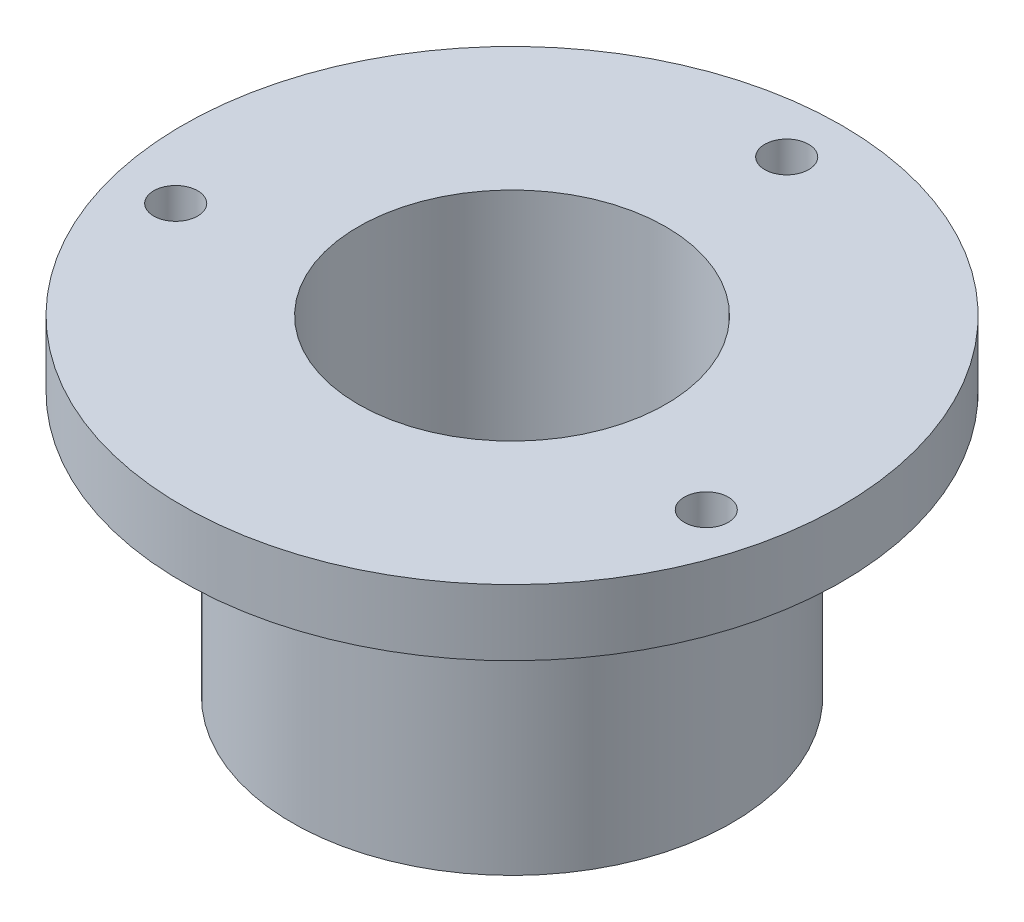
ISO-10303-21;
HEADER;
FILE_DESCRIPTION(('STEP AP214'),'2;1');
FILE_NAME('part.step','',(''),(''),'','','');
FILE_SCHEMA(('AUTOMOTIVE_DESIGN { 1 0 10303 214 1 1 1 1 }'));
ENDSEC;
DATA;
#1=APPLICATION_CONTEXT('core data for automotive mechanical design processes');
#2=APPLICATION_PROTOCOL_DEFINITION('international standard','automotive_design',2000,#1);
#3=PRODUCT_CONTEXT('',#1,'mechanical');
#4=PRODUCT('Part','Part','',(#3));
#5=PRODUCT_RELATED_PRODUCT_CATEGORY('part','',(#4));
#6=PRODUCT_DEFINITION_FORMATION('','',#4);
#7=PRODUCT_DEFINITION_CONTEXT('part definition',#1,'design');
#8=PRODUCT_DEFINITION('design','',#6,#7);
#9=PRODUCT_DEFINITION_SHAPE('','',#8);
#10=(LENGTH_UNIT() NAMED_UNIT(*) SI_UNIT(.MILLI.,.METRE.));
#11=(NAMED_UNIT(*) PLANE_ANGLE_UNIT() SI_UNIT($,.RADIAN.));
#12=(NAMED_UNIT(*) SI_UNIT($,.STERADIAN.) SOLID_ANGLE_UNIT());
#13=UNCERTAINTY_MEASURE_WITH_UNIT(LENGTH_MEASURE(1.E-05),#10,'distance_accuracy_value','');
#14=(GEOMETRIC_REPRESENTATION_CONTEXT(3) GLOBAL_UNCERTAINTY_ASSIGNED_CONTEXT((#13)) GLOBAL_UNIT_ASSIGNED_CONTEXT((#10,
#11,#12)) REPRESENTATION_CONTEXT('',''));
#15=CARTESIAN_POINT('',(0.,0.,0.));
#16=DIRECTION('',(0.,0.,1.));
#17=DIRECTION('',(1.,0.,0.));
#18=AXIS2_PLACEMENT_3D('',#15,#16,#17);
#19=CARTESIAN_POINT('',(7.,0.,0.));
#20=DIRECTION('',(0.,-1.,0.));
#21=DIRECTION('',(0.,0.,-1.));
#22=AXIS2_PLACEMENT_3D('',#19,#20,#21);
#23=PLANE('',#22);
#24=CARTESIAN_POINT('',(0.,0.,8.5));
#25=DIRECTION('',(0.,-1.,0.));
#26=DIRECTION('',(0.,0.,-1.));
#27=AXIS2_PLACEMENT_3D('',#24,#25,#26);
#28=CIRCLE('',#27,0.8);
#29=CARTESIAN_POINT('',(0.,0.,7.7));
#30=VERTEX_POINT('',#29);
#31=EDGE_CURVE('E87',#30,#30,#28,.T.);
#32=ORIENTED_EDGE('',*,*,#31,.F.);
#33=EDGE_LOOP('',(#32));
#34=FACE_BOUND('',#33,.T.);
#35=CARTESIAN_POINT('',(7.36121593216771,0.,-4.25000000000003));
#36=DIRECTION('',(0.,-1.,0.));
#37=DIRECTION('',(0.,0.,-1.));
#38=AXIS2_PLACEMENT_3D('',#35,#36,#37);
#39=CIRCLE('',#38,0.8);
#40=CARTESIAN_POINT('',(7.36121593216771,0.,-5.05000000000004));
#41=VERTEX_POINT('',#40);
#42=EDGE_CURVE('E81',#41,#41,#39,.T.);
#43=ORIENTED_EDGE('',*,*,#42,.F.);
#44=EDGE_LOOP('',(#43));
#45=FACE_BOUND('',#44,.T.);
#46=CARTESIAN_POINT('',(-7.36121593216777,0.,-4.24999999999993));
#47=DIRECTION('',(0.,-1.,0.));
#48=DIRECTION('',(0.,0.,-1.));
#49=AXIS2_PLACEMENT_3D('',#46,#47,#48);
#50=CIRCLE('',#49,0.8);
#51=CARTESIAN_POINT('',(-7.36121593216777,0.,-5.04999999999993));
#52=VERTEX_POINT('',#51);
#53=EDGE_CURVE('E75',#52,#52,#50,.T.);
#54=ORIENTED_EDGE('',*,*,#53,.F.);
#55=EDGE_LOOP('',(#54));
#56=FACE_BOUND('',#55,.T.);
#57=CARTESIAN_POINT('',(0.,0.,0.));
#58=DIRECTION('',(0.,-1.,0.));
#59=DIRECTION('',(0.,0.,-1.));
#60=AXIS2_PLACEMENT_3D('',#57,#58,#59);
#61=CIRCLE('',#60,10.);
#62=CARTESIAN_POINT('',(0.,0.,-10.));
#63=VERTEX_POINT('',#62);
#64=EDGE_CURVE('E10',#63,#63,#61,.T.);
#65=ORIENTED_EDGE('',*,*,#64,.T.);
#66=EDGE_LOOP('',(#65));
#67=FACE_BOUND('',#66,.T.);
#68=CARTESIAN_POINT('',(0.,0.,0.));
#69=DIRECTION('',(0.,-1.,0.));
#70=DIRECTION('',(0.,0.,-1.));
#71=AXIS2_PLACEMENT_3D('',#68,#69,#70);
#72=CIRCLE('',#71,7.);
#73=CARTESIAN_POINT('',(0.,0.,-7.));
#74=VERTEX_POINT('',#73);
#75=EDGE_CURVE('E53',#74,#74,#72,.T.);
#76=ORIENTED_EDGE('',*,*,#75,.F.);
#77=EDGE_LOOP('',(#76));
#78=FACE_BOUND('',#77,.T.);
#79=ADVANCED_FACE('F31',(#34,#45,#56,#67,#78),#23,.T.);
#80=CARTESIAN_POINT('',(0.,0.,0.));
#81=DIRECTION('',(0.,-1.,0.));
#82=DIRECTION('',(0.,0.,-1.));
#83=AXIS2_PLACEMENT_3D('',#80,#81,#82);
#84=CYLINDRICAL_SURFACE('',#83,10.);
#85=CARTESIAN_POINT('',(0.,12.,0.));
#86=DIRECTION('',(0.,-1.,0.));
#87=DIRECTION('',(0.,0.,-1.));
#88=AXIS2_PLACEMENT_3D('',#85,#86,#87);
#89=CIRCLE('',#88,10.);
#90=CARTESIAN_POINT('',(0.,12.,-10.));
#91=VERTEX_POINT('',#90);
#92=EDGE_CURVE('E37',#91,#91,#89,.T.);
#93=ORIENTED_EDGE('',*,*,#92,.T.);
#94=EDGE_LOOP('',(#93));
#95=FACE_BOUND('',#94,.T.);
#96=ORIENTED_EDGE('',*,*,#64,.F.);
#97=EDGE_LOOP('',(#96));
#98=FACE_BOUND('',#97,.T.);
#99=ADVANCED_FACE('F104',(#95,#98),#84,.T.);
#100=CARTESIAN_POINT('',(10.,12.,0.));
#101=DIRECTION('',(0.,-1.,0.));
#102=DIRECTION('',(0.,0.,-1.));
#103=AXIS2_PLACEMENT_3D('',#100,#101,#102);
#104=PLANE('',#103);
#105=CARTESIAN_POINT('',(0.,12.,-12.5));
#106=DIRECTION('',(0.,-1.,0.));
#107=DIRECTION('',(0.,0.,-1.));
#108=AXIS2_PLACEMENT_3D('',#105,#106,#107);
#109=CIRCLE('',#108,1.);
#110=CARTESIAN_POINT('',(0.,12.,-13.5));
#111=VERTEX_POINT('',#110);
#112=EDGE_CURVE('E56',#111,#111,#109,.T.);
#113=ORIENTED_EDGE('',*,*,#112,.F.);
#114=EDGE_LOOP('',(#113));
#115=FACE_BOUND('',#114,.T.);
#116=CARTESIAN_POINT('',(-12.0740728286133,12.,3.23523806378156));
#117=DIRECTION('',(0.,-1.,0.));
#118=DIRECTION('',(0.,0.,-1.));
#119=AXIS2_PLACEMENT_3D('',#116,#117,#118);
#120=CIRCLE('',#119,1.);
#121=CARTESIAN_POINT('',(-12.0740728286133,12.,2.23523806378156));
#122=VERTEX_POINT('',#121);
#123=EDGE_CURVE('E59',#122,#122,#120,.T.);
#124=ORIENTED_EDGE('',*,*,#123,.F.);
#125=EDGE_LOOP('',(#124));
#126=FACE_BOUND('',#125,.T.);
#127=CARTESIAN_POINT('',(12.0740728286133,12.,3.23523806378156));
#128=DIRECTION('',(0.,-1.,0.));
#129=DIRECTION('',(0.,0.,-1.));
#130=AXIS2_PLACEMENT_3D('',#127,#128,#129);
#131=CIRCLE('',#130,1.);
#132=CARTESIAN_POINT('',(12.0740728286133,12.,2.23523806378156));
#133=VERTEX_POINT('',#132);
#134=EDGE_CURVE('E62',#133,#133,#131,.T.);
#135=ORIENTED_EDGE('',*,*,#134,.F.);
#136=EDGE_LOOP('',(#135));
#137=FACE_BOUND('',#136,.T.);
#138=CARTESIAN_POINT('',(0.,12.,0.));
#139=DIRECTION('',(0.,-1.,0.));
#140=DIRECTION('',(0.,0.,-1.));
#141=AXIS2_PLACEMENT_3D('',#138,#139,#140);
#142=CIRCLE('',#141,15.);
#143=CARTESIAN_POINT('',(0.,12.,-15.));
#144=VERTEX_POINT('',#143);
#145=EDGE_CURVE('E41',#144,#144,#142,.T.);
#146=ORIENTED_EDGE('',*,*,#145,.T.);
#147=EDGE_LOOP('',(#146));
#148=FACE_BOUND('',#147,.T.);
#149=ORIENTED_EDGE('',*,*,#92,.F.);
#150=EDGE_LOOP('',(#149));
#151=FACE_BOUND('',#150,.T.);
#152=ADVANCED_FACE('F128',(#115,#126,#137,#148,#151),#104,.T.);
#153=CARTESIAN_POINT('',(0.,0.,0.));
#154=DIRECTION('',(0.,-1.,0.));
#155=DIRECTION('',(0.,0.,-1.));
#156=AXIS2_PLACEMENT_3D('',#153,#154,#155);
#157=CYLINDRICAL_SURFACE('',#156,15.);
#158=CARTESIAN_POINT('',(0.,15.,0.));
#159=DIRECTION('',(0.,-1.,0.));
#160=DIRECTION('',(0.,0.,-1.));
#161=AXIS2_PLACEMENT_3D('',#158,#159,#160);
#162=CIRCLE('',#161,15.);
#163=CARTESIAN_POINT('',(0.,15.,-15.));
#164=VERTEX_POINT('',#163);
#165=EDGE_CURVE('E45',#164,#164,#162,.T.);
#166=ORIENTED_EDGE('',*,*,#165,.T.);
#167=EDGE_LOOP('',(#166));
#168=FACE_BOUND('',#167,.T.);
#169=ORIENTED_EDGE('',*,*,#145,.F.);
#170=EDGE_LOOP('',(#169));
#171=FACE_BOUND('',#170,.T.);
#172=ADVANCED_FACE('F121',(#168,#171),#157,.T.);
#173=CARTESIAN_POINT('',(15.,15.,0.));
#174=DIRECTION('',(0.,1.,0.));
#175=DIRECTION('',(0.,0.,1.));
#176=AXIS2_PLACEMENT_3D('',#173,#174,#175);
#177=PLANE('',#176);
#178=CARTESIAN_POINT('',(0.,15.,-12.5));
#179=DIRECTION('',(0.,1.,0.));
#180=DIRECTION('',(0.,0.,1.));
#181=AXIS2_PLACEMENT_3D('',#178,#179,#180);
#182=CIRCLE('',#181,1.);
#183=CARTESIAN_POINT('',(0.,15.,-11.5));
#184=VERTEX_POINT('',#183);
#185=EDGE_CURVE('E65',#184,#184,#182,.T.);
#186=ORIENTED_EDGE('',*,*,#185,.F.);
#187=EDGE_LOOP('',(#186));
#188=FACE_BOUND('',#187,.T.);
#189=CARTESIAN_POINT('',(-12.0740728286133,15.,3.23523806378156));
#190=DIRECTION('',(0.,1.,0.));
#191=DIRECTION('',(0.,0.,1.));
#192=AXIS2_PLACEMENT_3D('',#189,#190,#191);
#193=CIRCLE('',#192,1.);
#194=CARTESIAN_POINT('',(-12.0740728286133,15.,4.23523806378156));
#195=VERTEX_POINT('',#194);
#196=EDGE_CURVE('E69',#195,#195,#193,.T.);
#197=ORIENTED_EDGE('',*,*,#196,.F.);
#198=EDGE_LOOP('',(#197));
#199=FACE_BOUND('',#198,.T.);
#200=CARTESIAN_POINT('',(12.0740728286133,15.,3.23523806378156));
#201=DIRECTION('',(0.,1.,0.));
#202=DIRECTION('',(0.,0.,1.));
#203=AXIS2_PLACEMENT_3D('',#200,#201,#202);
#204=CIRCLE('',#203,1.);
#205=CARTESIAN_POINT('',(12.0740728286133,15.,4.23523806378157));
#206=VERTEX_POINT('',#205);
#207=EDGE_CURVE('E66',#206,#206,#204,.T.);
#208=ORIENTED_EDGE('',*,*,#207,.F.);
#209=EDGE_LOOP('',(#208));
#210=FACE_BOUND('',#209,.T.);
#211=CARTESIAN_POINT('',(0.,15.,0.));
#212=DIRECTION('',(0.,-1.,0.));
#213=DIRECTION('',(0.,0.,-1.));
#214=AXIS2_PLACEMENT_3D('',#211,#212,#213);
#215=CIRCLE('',#214,7.);
#216=CARTESIAN_POINT('',(0.,15.,-7.));
#217=VERTEX_POINT('',#216);
#218=EDGE_CURVE('E50',#217,#217,#215,.T.);
#219=ORIENTED_EDGE('',*,*,#218,.T.);
#220=EDGE_LOOP('',(#219));
#221=FACE_BOUND('',#220,.T.);
#222=ORIENTED_EDGE('',*,*,#165,.F.);
#223=EDGE_LOOP('',(#222));
#224=FACE_BOUND('',#223,.T.);
#225=ADVANCED_FACE('F115',(#188,#199,#210,#221,#224),#177,.T.);
#226=CARTESIAN_POINT('',(0.,0.,0.));
#227=DIRECTION('',(0.,-1.,0.));
#228=DIRECTION('',(0.,0.,-1.));
#229=AXIS2_PLACEMENT_3D('',#226,#227,#228);
#230=CYLINDRICAL_SURFACE('',#229,7.);
#231=ORIENTED_EDGE('',*,*,#75,.T.);
#232=EDGE_LOOP('',(#231));
#233=FACE_BOUND('',#232,.T.);
#234=ORIENTED_EDGE('',*,*,#218,.F.);
#235=EDGE_LOOP('',(#234));
#236=FACE_BOUND('',#235,.T.);
#237=ADVANCED_FACE('F111',(#233,#236),#230,.F.);
#238=CARTESIAN_POINT('',(12.0740728286133,0.,3.23523806378156));
#239=DIRECTION('',(0.,1.,0.));
#240=DIRECTION('',(0.,0.,1.));
#241=AXIS2_PLACEMENT_3D('',#238,#239,#240);
#242=CYLINDRICAL_SURFACE('',#241,1.);
#243=ORIENTED_EDGE('',*,*,#134,.T.);
#244=EDGE_LOOP('',(#243));
#245=FACE_BOUND('',#244,.T.);
#246=ORIENTED_EDGE('',*,*,#207,.T.);
#247=EDGE_LOOP('',(#246));
#248=FACE_BOUND('',#247,.T.);
#249=ADVANCED_FACE('F114',(#245,#248),#242,.F.);
#250=CARTESIAN_POINT('',(-12.0740728286133,0.,3.23523806378156));
#251=DIRECTION('',(0.,1.,0.));
#252=DIRECTION('',(0.,0.,1.));
#253=AXIS2_PLACEMENT_3D('',#250,#251,#252);
#254=CYLINDRICAL_SURFACE('',#253,1.);
#255=ORIENTED_EDGE('',*,*,#123,.T.);
#256=EDGE_LOOP('',(#255));
#257=FACE_BOUND('',#256,.T.);
#258=ORIENTED_EDGE('',*,*,#196,.T.);
#259=EDGE_LOOP('',(#258));
#260=FACE_BOUND('',#259,.T.);
#261=ADVANCED_FACE('F144',(#257,#260),#254,.F.);
#262=CARTESIAN_POINT('',(0.,0.,-12.5));
#263=DIRECTION('',(0.,1.,0.));
#264=DIRECTION('',(0.,0.,1.));
#265=AXIS2_PLACEMENT_3D('',#262,#263,#264);
#266=CYLINDRICAL_SURFACE('',#265,1.);
#267=ORIENTED_EDGE('',*,*,#112,.T.);
#268=EDGE_LOOP('',(#267));
#269=FACE_BOUND('',#268,.T.);
#270=ORIENTED_EDGE('',*,*,#185,.T.);
#271=EDGE_LOOP('',(#270));
#272=FACE_BOUND('',#271,.T.);
#273=ADVANCED_FACE('F148',(#269,#272),#266,.F.);
#274=CARTESIAN_POINT('',(-7.36121593216777,2.5,-4.24999999999993));
#275=DIRECTION('',(0.,-1.,0.));
#276=DIRECTION('',(0.,0.,-1.));
#277=AXIS2_PLACEMENT_3D('',#274,#275,#276);
#278=CYLINDRICAL_SURFACE('',#277,0.8);
#279=CARTESIAN_POINT('',(-7.36121593216777,2.5,-4.24999999999993));
#280=DIRECTION('',(0.,-1.,0.));
#281=DIRECTION('',(0.,0.,-1.));
#282=AXIS2_PLACEMENT_3D('',#279,#280,#281);
#283=CIRCLE('',#282,0.8);
#284=CARTESIAN_POINT('',(-7.36121593216777,2.5,-5.04999999999993));
#285=VERTEX_POINT('',#284);
#286=EDGE_CURVE('E78',#285,#285,#283,.T.);
#287=ORIENTED_EDGE('',*,*,#286,.F.);
#288=EDGE_LOOP('',(#287));
#289=FACE_BOUND('',#288,.T.);
#290=ORIENTED_EDGE('',*,*,#53,.T.);
#291=EDGE_LOOP('',(#290));
#292=FACE_BOUND('',#291,.T.);
#293=ADVANCED_FACE('F152',(#289,#292),#278,.F.);
#294=CARTESIAN_POINT('',(-7.36121593216777,2.5,-4.24999999999993));
#295=DIRECTION('',(0.,-1.,0.));
#296=DIRECTION('',(0.,0.,-1.));
#297=AXIS2_PLACEMENT_3D('',#294,#295,#296);
#298=PLANE('',#297);
#299=ORIENTED_EDGE('',*,*,#286,.T.);
#300=EDGE_LOOP('',(#299));
#301=FACE_BOUND('',#300,.T.);
#302=ADVANCED_FACE('F156',(#301),#298,.T.);
#303=CARTESIAN_POINT('',(7.36121593216771,2.5,-4.25000000000003));
#304=DIRECTION('',(0.,-1.,0.));
#305=DIRECTION('',(0.,0.,-1.));
#306=AXIS2_PLACEMENT_3D('',#303,#304,#305);
#307=CYLINDRICAL_SURFACE('',#306,0.8);
#308=CARTESIAN_POINT('',(7.36121593216771,2.5,-4.25000000000003));
#309=DIRECTION('',(0.,-1.,0.));
#310=DIRECTION('',(0.,0.,-1.));
#311=AXIS2_PLACEMENT_3D('',#308,#309,#310);
#312=CIRCLE('',#311,0.8);
#313=CARTESIAN_POINT('',(7.36121593216771,2.5,-5.05000000000004));
#314=VERTEX_POINT('',#313);
#315=EDGE_CURVE('E84',#314,#314,#312,.T.);
#316=ORIENTED_EDGE('',*,*,#315,.F.);
#317=EDGE_LOOP('',(#316));
#318=FACE_BOUND('',#317,.T.);
#319=ORIENTED_EDGE('',*,*,#42,.T.);
#320=EDGE_LOOP('',(#319));
#321=FACE_BOUND('',#320,.T.);
#322=ADVANCED_FACE('F160',(#318,#321),#307,.F.);
#323=CARTESIAN_POINT('',(7.36121593216771,2.5,-4.25000000000003));
#324=DIRECTION('',(0.,-1.,0.));
#325=DIRECTION('',(0.,0.,-1.));
#326=AXIS2_PLACEMENT_3D('',#323,#324,#325);
#327=PLANE('',#326);
#328=ORIENTED_EDGE('',*,*,#315,.T.);
#329=EDGE_LOOP('',(#328));
#330=FACE_BOUND('',#329,.T.);
#331=ADVANCED_FACE('F98',(#330),#327,.T.);
#332=CARTESIAN_POINT('',(0.,2.5,8.5));
#333=DIRECTION('',(0.,-1.,0.));
#334=DIRECTION('',(0.,0.,-1.));
#335=AXIS2_PLACEMENT_3D('',#332,#333,#334);
#336=CYLINDRICAL_SURFACE('',#335,0.8);
#337=CARTESIAN_POINT('',(0.,2.5,8.5));
#338=DIRECTION('',(0.,-1.,0.));
#339=DIRECTION('',(0.,0.,-1.));
#340=AXIS2_PLACEMENT_3D('',#337,#338,#339);
#341=CIRCLE('',#340,0.8);
#342=CARTESIAN_POINT('',(0.,2.5,7.7));
#343=VERTEX_POINT('',#342);
#344=EDGE_CURVE('E70',#343,#343,#341,.T.);
#345=ORIENTED_EDGE('',*,*,#344,.F.);
#346=EDGE_LOOP('',(#345));
#347=FACE_BOUND('',#346,.T.);
#348=ORIENTED_EDGE('',*,*,#31,.T.);
#349=EDGE_LOOP('',(#348));
#350=FACE_BOUND('',#349,.T.);
#351=ADVANCED_FACE('F95',(#347,#350),#336,.F.);
#352=CARTESIAN_POINT('',(0.,2.5,8.5));
#353=DIRECTION('',(0.,-1.,0.));
#354=DIRECTION('',(0.,0.,-1.));
#355=AXIS2_PLACEMENT_3D('',#352,#353,#354);
#356=PLANE('',#355);
#357=ORIENTED_EDGE('',*,*,#344,.T.);
#358=EDGE_LOOP('',(#357));
#359=FACE_BOUND('',#358,.T.);
#360=ADVANCED_FACE('F93',(#359),#356,.T.);
#361=CLOSED_SHELL('',(#79,#99,#152,#172,#225,#237,#249,#261,#273,#293,#302,#322,#331,#351,#360));
#362=MANIFOLD_SOLID_BREP('B2',#361);
#363=ADVANCED_BREP_SHAPE_REPRESENTATION('',(#18,#362),#14);
#364=SHAPE_DEFINITION_REPRESENTATION(#9,#363);
ENDSEC;
END-ISO-10303-21;
